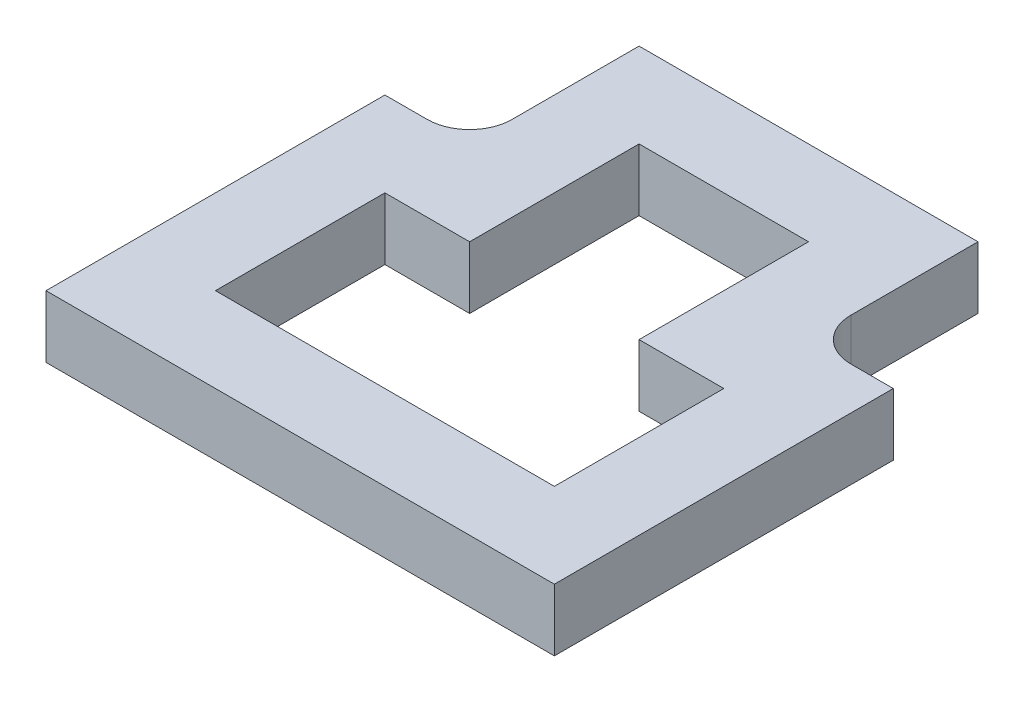
ISO-10303-21;
HEADER;
FILE_DESCRIPTION(('STEP AP214'),'2;1');
FILE_NAME('part.step','',(''),(''),'','','');
FILE_SCHEMA(('AUTOMOTIVE_DESIGN { 1 0 10303 214 1 1 1 1 }'));
ENDSEC;
DATA;
#1=APPLICATION_CONTEXT('core data for automotive mechanical design processes');
#2=APPLICATION_PROTOCOL_DEFINITION('international standard','automotive_design',2000,#1);
#3=PRODUCT_CONTEXT('',#1,'mechanical');
#4=PRODUCT('Part','Part','',(#3));
#5=PRODUCT_RELATED_PRODUCT_CATEGORY('part','',(#4));
#6=PRODUCT_DEFINITION_FORMATION('','',#4);
#7=PRODUCT_DEFINITION_CONTEXT('part definition',#1,'design');
#8=PRODUCT_DEFINITION('design','',#6,#7);
#9=PRODUCT_DEFINITION_SHAPE('','',#8);
#10=(LENGTH_UNIT() NAMED_UNIT(*) SI_UNIT(.MILLI.,.METRE.));
#11=(NAMED_UNIT(*) PLANE_ANGLE_UNIT() SI_UNIT($,.RADIAN.));
#12=(NAMED_UNIT(*) SI_UNIT($,.STERADIAN.) SOLID_ANGLE_UNIT());
#13=UNCERTAINTY_MEASURE_WITH_UNIT(LENGTH_MEASURE(1.E-05),#10,'distance_accuracy_value','');
#14=(GEOMETRIC_REPRESENTATION_CONTEXT(3) GLOBAL_UNCERTAINTY_ASSIGNED_CONTEXT((#13)) GLOBAL_UNIT_ASSIGNED_CONTEXT((#10,
#11,#12)) REPRESENTATION_CONTEXT('',''));
#15=CARTESIAN_POINT('',(0.,0.,0.));
#16=DIRECTION('',(0.,0.,1.));
#17=DIRECTION('',(1.,0.,0.));
#18=AXIS2_PLACEMENT_3D('',#15,#16,#17);
#19=CARTESIAN_POINT('',(37.5,14.,-7.49999999999994));
#20=DIRECTION('',(0.,-1.,0.));
#21=DIRECTION('',(0.,0.,-1.));
#22=AXIS2_PLACEMENT_3D('',#19,#20,#21);
#23=CYLINDRICAL_SURFACE('',#22,7.49999999999994);
#24=DIRECTION('',(0.,-1.,0.));
#25=VECTOR('',#24,1.);
#26=CARTESIAN_POINT('',(37.5,14.,0.));
#27=LINE('',#26,#25);
#28=CARTESIAN_POINT('',(37.5,19.,0.));
#29=VERTEX_POINT('',#28);
#30=CARTESIAN_POINT('',(37.5,8.,0.));
#31=VERTEX_POINT('',#30);
#32=EDGE_CURVE('E283',#29,#31,#27,.T.);
#33=ORIENTED_EDGE('',*,*,#32,.T.);
#34=CARTESIAN_POINT('',(37.5,8.,-7.49999999999994));
#35=DIRECTION('',(0.,1.,0.));
#36=DIRECTION('',(0.,0.,1.));
#37=AXIS2_PLACEMENT_3D('',#34,#35,#36);
#38=CIRCLE('',#37,7.49999999999994);
#39=CARTESIAN_POINT('',(30.,8.,-7.5));
#40=VERTEX_POINT('',#39);
#41=EDGE_CURVE('E258',#31,#40,#38,.F.);
#42=ORIENTED_EDGE('',*,*,#41,.T.);
#43=DIRECTION('',(0.,-1.,0.));
#44=VECTOR('',#43,1.);
#45=CARTESIAN_POINT('',(30.,14.,-7.5));
#46=LINE('',#45,#44);
#47=CARTESIAN_POINT('',(30.,19.,-7.5));
#48=VERTEX_POINT('',#47);
#49=EDGE_CURVE('E287',#48,#40,#46,.T.);
#50=ORIENTED_EDGE('',*,*,#49,.F.);
#51=CARTESIAN_POINT('',(37.5,19.,-7.49999999999994));
#52=DIRECTION('',(0.,-1.,0.));
#53=DIRECTION('',(0.,0.,1.));
#54=AXIS2_PLACEMENT_3D('',#51,#52,#53);
#55=CIRCLE('',#54,7.49999999999997);
#56=EDGE_CURVE('E225',#29,#48,#55,.T.);
#57=ORIENTED_EDGE('',*,*,#56,.F.);
#58=EDGE_LOOP('',(#33,#42,#50,#57));
#59=FACE_BOUND('',#58,.T.);
#60=ADVANCED_FACE('F42',(#59),#23,.F.);
#61=CARTESIAN_POINT('',(-37.5,14.,-7.5));
#62=DIRECTION('',(0.,-1.,0.));
#63=DIRECTION('',(0.,0.,-1.));
#64=AXIS2_PLACEMENT_3D('',#61,#62,#63);
#65=CYLINDRICAL_SURFACE('',#64,7.5);
#66=DIRECTION('',(0.,-1.,0.));
#67=VECTOR('',#66,1.);
#68=CARTESIAN_POINT('',(-30.,14.,-7.5));
#69=LINE('',#68,#67);
#70=CARTESIAN_POINT('',(-30.,19.,-7.49999999999999));
#71=VERTEX_POINT('',#70);
#72=CARTESIAN_POINT('',(-30.,8.,-7.5));
#73=VERTEX_POINT('',#72);
#74=EDGE_CURVE('E290',#71,#73,#69,.T.);
#75=ORIENTED_EDGE('',*,*,#74,.T.);
#76=CARTESIAN_POINT('',(-37.5,8.,-7.5));
#77=DIRECTION('',(0.,1.,0.));
#78=DIRECTION('',(0.,0.,1.));
#79=AXIS2_PLACEMENT_3D('',#76,#77,#78);
#80=CIRCLE('',#79,7.5);
#81=CARTESIAN_POINT('',(-37.5,8.,0.));
#82=VERTEX_POINT('',#81);
#83=EDGE_CURVE('E255',#73,#82,#80,.F.);
#84=ORIENTED_EDGE('',*,*,#83,.T.);
#85=DIRECTION('',(0.,-1.,0.));
#86=VECTOR('',#85,1.);
#87=CARTESIAN_POINT('',(-37.5,14.,0.));
#88=LINE('',#87,#86);
#89=CARTESIAN_POINT('',(-37.5,19.,0.));
#90=VERTEX_POINT('',#89);
#91=EDGE_CURVE('E282',#90,#82,#88,.T.);
#92=ORIENTED_EDGE('',*,*,#91,.F.);
#93=CARTESIAN_POINT('',(-37.5,19.,-7.5));
#94=DIRECTION('',(0.,-1.,0.));
#95=DIRECTION('',(0.,0.,1.));
#96=AXIS2_PLACEMENT_3D('',#93,#94,#95);
#97=CIRCLE('',#96,7.5);
#98=EDGE_CURVE('E207',#71,#90,#97,.T.);
#99=ORIENTED_EDGE('',*,*,#98,.F.);
#100=EDGE_LOOP('',(#75,#84,#92,#99));
#101=FACE_BOUND('',#100,.T.);
#102=ADVANCED_FACE('F331',(#101),#65,.F.);
#103=CARTESIAN_POINT('',(-30.,6.,-30.));
#104=DIRECTION('',(1.,0.,0.));
#105=DIRECTION('',(0.,0.,-1.));
#106=AXIS2_PLACEMENT_3D('',#103,#104,#105);
#107=PLANE('',#106);
#108=ORIENTED_EDGE('',*,*,#74,.F.);
#109=DIRECTION('',(0.,0.,1.));
#110=VECTOR('',#109,1.);
#111=CARTESIAN_POINT('',(-30.,19.,-7.49999999999999));
#112=LINE('',#111,#110);
#113=CARTESIAN_POINT('',(-30.,19.,-30.));
#114=VERTEX_POINT('',#113);
#115=EDGE_CURVE('E234',#114,#71,#112,.T.);
#116=ORIENTED_EDGE('',*,*,#115,.F.);
#117=DIRECTION('',(0.,1.,0.));
#118=VECTOR('',#117,1.);
#119=CARTESIAN_POINT('',(-30.,3.,-30.));
#120=LINE('',#119,#118);
#121=CARTESIAN_POINT('',(-30.,8.,-30.));
#122=VERTEX_POINT('',#121);
#123=EDGE_CURVE('E239',#122,#114,#120,.T.);
#124=ORIENTED_EDGE('',*,*,#123,.F.);
#125=DIRECTION('',(0.,0.,1.));
#126=VECTOR('',#125,1.);
#127=CARTESIAN_POINT('',(-30.,8.,-30.));
#128=LINE('',#127,#126);
#129=EDGE_CURVE('E253',#122,#73,#128,.T.);
#130=ORIENTED_EDGE('',*,*,#129,.T.);
#131=EDGE_LOOP('',(#108,#116,#124,#130));
#132=FACE_BOUND('',#131,.T.);
#133=ADVANCED_FACE('F44',(#132),#107,.F.);
#134=CARTESIAN_POINT('',(45.,6.,0.));
#135=DIRECTION('',(0.,0.,1.));
#136=DIRECTION('',(1.,0.,0.));
#137=AXIS2_PLACEMENT_3D('',#134,#135,#136);
#138=PLANE('',#137);
#139=DIRECTION('',(0.,-1.,0.));
#140=VECTOR('',#139,1.);
#141=CARTESIAN_POINT('',(45.,6.,0.));
#142=LINE('',#141,#140);
#143=CARTESIAN_POINT('',(45.,19.,0.));
#144=VERTEX_POINT('',#143);
#145=CARTESIAN_POINT('',(45.,8.,0.));
#146=VERTEX_POINT('',#145);
#147=EDGE_CURVE('E298',#144,#146,#142,.T.);
#148=ORIENTED_EDGE('',*,*,#147,.T.);
#149=DIRECTION('',(-1.,0.,0.));
#150=VECTOR('',#149,1.);
#151=CARTESIAN_POINT('',(45.,8.,0.));
#152=LINE('',#151,#150);
#153=EDGE_CURVE('E264',#146,#31,#152,.T.);
#154=ORIENTED_EDGE('',*,*,#153,.T.);
#155=ORIENTED_EDGE('',*,*,#32,.F.);
#156=DIRECTION('',(-1.,0.,0.));
#157=VECTOR('',#156,1.);
#158=CARTESIAN_POINT('',(45.,19.,0.));
#159=LINE('',#158,#157);
#160=EDGE_CURVE('E222',#144,#29,#159,.T.);
#161=ORIENTED_EDGE('',*,*,#160,.F.);
#162=EDGE_LOOP('',(#148,#154,#155,#161));
#163=FACE_BOUND('',#162,.T.);
#164=ADVANCED_FACE('F346',(#163),#138,.F.);
#165=CARTESIAN_POINT('',(-30.,6.,0.));
#166=DIRECTION('',(0.,0.,1.));
#167=DIRECTION('',(1.,0.,0.));
#168=AXIS2_PLACEMENT_3D('',#165,#166,#167);
#169=PLANE('',#168);
#170=ORIENTED_EDGE('',*,*,#91,.T.);
#171=DIRECTION('',(-1.,0.,0.));
#172=VECTOR('',#171,1.);
#173=CARTESIAN_POINT('',(-30.,8.,0.));
#174=LINE('',#173,#172);
#175=CARTESIAN_POINT('',(-45.,8.,0.));
#176=VERTEX_POINT('',#175);
#177=EDGE_CURVE('E261',#82,#176,#174,.T.);
#178=ORIENTED_EDGE('',*,*,#177,.T.);
#179=DIRECTION('',(0.,-1.,0.));
#180=VECTOR('',#179,1.);
#181=CARTESIAN_POINT('',(-45.,6.,0.));
#182=LINE('',#181,#180);
#183=CARTESIAN_POINT('',(-45.,19.,0.));
#184=VERTEX_POINT('',#183);
#185=EDGE_CURVE('E50',#184,#176,#182,.T.);
#186=ORIENTED_EDGE('',*,*,#185,.F.);
#187=DIRECTION('',(-1.,0.,0.));
#188=VECTOR('',#187,1.);
#189=CARTESIAN_POINT('',(-37.5,19.,0.));
#190=LINE('',#189,#188);
#191=EDGE_CURVE('E210',#90,#184,#190,.T.);
#192=ORIENTED_EDGE('',*,*,#191,.F.);
#193=EDGE_LOOP('',(#170,#178,#186,#192));
#194=FACE_BOUND('',#193,.T.);
#195=ADVANCED_FACE('F325',(#194),#169,.F.);
#196=CARTESIAN_POINT('',(-45.,6.,0.));
#197=DIRECTION('',(1.,0.,0.));
#198=DIRECTION('',(0.,0.,-1.));
#199=AXIS2_PLACEMENT_3D('',#196,#197,#198);
#200=PLANE('',#199);
#201=ORIENTED_EDGE('',*,*,#185,.T.);
#202=DIRECTION('',(0.,0.,1.));
#203=VECTOR('',#202,1.);
#204=CARTESIAN_POINT('',(-45.,8.,-33.));
#205=LINE('',#204,#203);
#206=CARTESIAN_POINT('',(-45.,8.,60.));
#207=VERTEX_POINT('',#206);
#208=EDGE_CURVE('E246',#176,#207,#205,.T.);
#209=ORIENTED_EDGE('',*,*,#208,.T.);
#210=DIRECTION('',(0.,-1.,0.));
#211=VECTOR('',#210,1.);
#212=CARTESIAN_POINT('',(-45.,6.,60.));
#213=LINE('',#212,#211);
#214=CARTESIAN_POINT('',(-45.,19.,60.));
#215=VERTEX_POINT('',#214);
#216=EDGE_CURVE('E317',#215,#207,#213,.T.);
#217=ORIENTED_EDGE('',*,*,#216,.F.);
#218=DIRECTION('',(0.,0.,1.));
#219=VECTOR('',#218,1.);
#220=CARTESIAN_POINT('',(-45.,19.,0.));
#221=LINE('',#220,#219);
#222=EDGE_CURVE('E213',#184,#215,#221,.T.);
#223=ORIENTED_EDGE('',*,*,#222,.F.);
#224=EDGE_LOOP('',(#201,#209,#217,#223));
#225=FACE_BOUND('',#224,.T.);
#226=ADVANCED_FACE('F322',(#225),#200,.F.);
#227=CARTESIAN_POINT('',(-45.,6.,60.));
#228=DIRECTION('',(0.,0.,-1.));
#229=DIRECTION('',(-1.,0.,0.));
#230=AXIS2_PLACEMENT_3D('',#227,#228,#229);
#231=PLANE('',#230);
#232=ORIENTED_EDGE('',*,*,#216,.T.);
#233=DIRECTION('',(-1.,0.,0.));
#234=VECTOR('',#233,1.);
#235=CARTESIAN_POINT('',(-45.,8.,60.));
#236=LINE('',#235,#234);
#237=CARTESIAN_POINT('',(45.,8.,60.));
#238=VERTEX_POINT('',#237);
#239=EDGE_CURVE('E242',#238,#207,#236,.T.);
#240=ORIENTED_EDGE('',*,*,#239,.F.);
#241=DIRECTION('',(0.,-1.,0.));
#242=VECTOR('',#241,1.);
#243=CARTESIAN_POINT('',(45.,6.,60.));
#244=LINE('',#243,#242);
#245=CARTESIAN_POINT('',(45.,19.,60.));
#246=VERTEX_POINT('',#245);
#247=EDGE_CURVE('E314',#246,#238,#244,.T.);
#248=ORIENTED_EDGE('',*,*,#247,.F.);
#249=DIRECTION('',(1.,0.,0.));
#250=VECTOR('',#249,1.);
#251=CARTESIAN_POINT('',(-45.,19.,60.));
#252=LINE('',#251,#250);
#253=EDGE_CURVE('E216',#215,#246,#252,.T.);
#254=ORIENTED_EDGE('',*,*,#253,.F.);
#255=EDGE_LOOP('',(#232,#240,#248,#254));
#256=FACE_BOUND('',#255,.T.);
#257=ADVANCED_FACE('F339',(#256),#231,.F.);
#258=CARTESIAN_POINT('',(45.,6.,60.));
#259=DIRECTION('',(-1.,0.,0.));
#260=DIRECTION('',(0.,0.,1.));
#261=AXIS2_PLACEMENT_3D('',#258,#259,#260);
#262=PLANE('',#261);
#263=ORIENTED_EDGE('',*,*,#247,.T.);
#264=DIRECTION('',(0.,0.,1.));
#265=VECTOR('',#264,1.);
#266=CARTESIAN_POINT('',(45.,8.,-33.));
#267=LINE('',#266,#265);
#268=EDGE_CURVE('E245',#146,#238,#267,.T.);
#269=ORIENTED_EDGE('',*,*,#268,.F.);
#270=ORIENTED_EDGE('',*,*,#147,.F.);
#271=DIRECTION('',(0.,0.,-1.));
#272=VECTOR('',#271,1.);
#273=CARTESIAN_POINT('',(45.,19.,60.));
#274=LINE('',#273,#272);
#275=EDGE_CURVE('E219',#246,#144,#274,.T.);
#276=ORIENTED_EDGE('',*,*,#275,.F.);
#277=EDGE_LOOP('',(#263,#269,#270,#276));
#278=FACE_BOUND('',#277,.T.);
#279=ADVANCED_FACE('F342',(#278),#262,.F.);
#280=CARTESIAN_POINT('',(30.,6.,0.));
#281=DIRECTION('',(-1.,0.,0.));
#282=DIRECTION('',(0.,0.,1.));
#283=AXIS2_PLACEMENT_3D('',#280,#281,#282);
#284=PLANE('',#283);
#285=DIRECTION('',(0.,0.,-1.));
#286=VECTOR('',#285,1.);
#287=CARTESIAN_POINT('',(30.,8.,0.));
#288=LINE('',#287,#286);
#289=CARTESIAN_POINT('',(30.,8.,-30.));
#290=VERTEX_POINT('',#289);
#291=EDGE_CURVE('E249',#40,#290,#288,.T.);
#292=ORIENTED_EDGE('',*,*,#291,.T.);
#293=DIRECTION('',(0.,1.,0.));
#294=VECTOR('',#293,1.);
#295=CARTESIAN_POINT('',(30.,3.,-30.));
#296=LINE('',#295,#294);
#297=CARTESIAN_POINT('',(30.,19.,-30.));
#298=VERTEX_POINT('',#297);
#299=EDGE_CURVE('E57',#290,#298,#296,.T.);
#300=ORIENTED_EDGE('',*,*,#299,.T.);
#301=DIRECTION('',(0.,0.,-1.));
#302=VECTOR('',#301,1.);
#303=CARTESIAN_POINT('',(30.,19.,-30.));
#304=LINE('',#303,#302);
#305=EDGE_CURVE('E228',#48,#298,#304,.T.);
#306=ORIENTED_EDGE('',*,*,#305,.F.);
#307=ORIENTED_EDGE('',*,*,#49,.T.);
#308=EDGE_LOOP('',(#292,#300,#306,#307));
#309=FACE_BOUND('',#308,.T.);
#310=ADVANCED_FACE('F350',(#309),#284,.F.);
#311=CARTESIAN_POINT('',(30.,6.,45.));
#312=DIRECTION('',(0.,0.,1.));
#313=DIRECTION('',(1.,0.,0.));
#314=AXIS2_PLACEMENT_3D('',#311,#312,#313);
#315=PLANE('',#314);
#316=DIRECTION('',(0.,-1.,0.));
#317=VECTOR('',#316,1.);
#318=CARTESIAN_POINT('',(30.,6.,45.));
#319=LINE('',#318,#317);
#320=CARTESIAN_POINT('',(30.,19.,45.));
#321=VERTEX_POINT('',#320);
#322=CARTESIAN_POINT('',(30.,8.,45.));
#323=VERTEX_POINT('',#322);
#324=EDGE_CURVE('E295',#321,#323,#319,.T.);
#325=ORIENTED_EDGE('',*,*,#324,.T.);
#326=DIRECTION('',(-1.,0.,0.));
#327=VECTOR('',#326,1.);
#328=CARTESIAN_POINT('',(30.,8.,45.));
#329=LINE('',#328,#327);
#330=CARTESIAN_POINT('',(-30.,8.,45.));
#331=VERTEX_POINT('',#330);
#332=EDGE_CURVE('E276',#323,#331,#329,.T.);
#333=ORIENTED_EDGE('',*,*,#332,.T.);
#334=DIRECTION('',(0.,-1.,0.));
#335=VECTOR('',#334,1.);
#336=CARTESIAN_POINT('',(-30.,6.,45.));
#337=LINE('',#336,#335);
#338=CARTESIAN_POINT('',(-30.,19.,45.));
#339=VERTEX_POINT('',#338);
#340=EDGE_CURVE('E286',#339,#331,#337,.T.);
#341=ORIENTED_EDGE('',*,*,#340,.F.);
#342=DIRECTION('',(1.,0.,0.));
#343=VECTOR('',#342,1.);
#344=CARTESIAN_POINT('',(-30.,19.,45.));
#345=LINE('',#344,#343);
#346=EDGE_CURVE('E196',#339,#321,#345,.T.);
#347=ORIENTED_EDGE('',*,*,#346,.T.);
#348=EDGE_LOOP('',(#325,#333,#341,#347));
#349=FACE_BOUND('',#348,.T.);
#350=ADVANCED_FACE('F372',(#349),#315,.F.);
#351=CARTESIAN_POINT('',(30.,6.,15.));
#352=DIRECTION('',(1.,0.,0.));
#353=DIRECTION('',(0.,0.,-1.));
#354=AXIS2_PLACEMENT_3D('',#351,#352,#353);
#355=PLANE('',#354);
#356=DIRECTION('',(0.,-1.,0.));
#357=VECTOR('',#356,1.);
#358=CARTESIAN_POINT('',(30.,6.,15.));
#359=LINE('',#358,#357);
#360=CARTESIAN_POINT('',(30.,19.,15.));
#361=VERTEX_POINT('',#360);
#362=CARTESIAN_POINT('',(30.,8.,15.));
#363=VERTEX_POINT('',#362);
#364=EDGE_CURVE('E299',#361,#363,#359,.T.);
#365=ORIENTED_EDGE('',*,*,#364,.T.);
#366=DIRECTION('',(0.,0.,1.));
#367=VECTOR('',#366,1.);
#368=CARTESIAN_POINT('',(30.,8.,15.));
#369=LINE('',#368,#367);
#370=EDGE_CURVE('E273',#363,#323,#369,.T.);
#371=ORIENTED_EDGE('',*,*,#370,.T.);
#372=ORIENTED_EDGE('',*,*,#324,.F.);
#373=DIRECTION('',(0.,0.,-1.));
#374=VECTOR('',#373,1.);
#375=CARTESIAN_POINT('',(30.,19.,45.));
#376=LINE('',#375,#374);
#377=EDGE_CURVE('E199',#321,#361,#376,.T.);
#378=ORIENTED_EDGE('',*,*,#377,.T.);
#379=EDGE_LOOP('',(#365,#371,#372,#378));
#380=FACE_BOUND('',#379,.T.);
#381=ADVANCED_FACE('F368',(#380),#355,.F.);
#382=CARTESIAN_POINT('',(15.,6.,15.));
#383=DIRECTION('',(0.,0.,-1.));
#384=DIRECTION('',(-1.,0.,0.));
#385=AXIS2_PLACEMENT_3D('',#382,#383,#384);
#386=PLANE('',#385);
#387=DIRECTION('',(0.,-1.,0.));
#388=VECTOR('',#387,1.);
#389=CARTESIAN_POINT('',(15.,6.,15.));
#390=LINE('',#389,#388);
#391=CARTESIAN_POINT('',(15.,19.,15.));
#392=VERTEX_POINT('',#391);
#393=CARTESIAN_POINT('',(15.,8.,15.));
#394=VERTEX_POINT('',#393);
#395=EDGE_CURVE('E302',#392,#394,#390,.T.);
#396=ORIENTED_EDGE('',*,*,#395,.T.);
#397=DIRECTION('',(1.,0.,0.));
#398=VECTOR('',#397,1.);
#399=CARTESIAN_POINT('',(15.,8.,15.));
#400=LINE('',#399,#398);
#401=EDGE_CURVE('E270',#394,#363,#400,.T.);
#402=ORIENTED_EDGE('',*,*,#401,.T.);
#403=ORIENTED_EDGE('',*,*,#364,.F.);
#404=DIRECTION('',(-1.,0.,0.));
#405=VECTOR('',#404,1.);
#406=CARTESIAN_POINT('',(30.,19.,15.));
#407=LINE('',#406,#405);
#408=EDGE_CURVE('E202',#361,#392,#407,.T.);
#409=ORIENTED_EDGE('',*,*,#408,.T.);
#410=EDGE_LOOP('',(#396,#402,#403,#409));
#411=FACE_BOUND('',#410,.T.);
#412=ADVANCED_FACE('F371',(#411),#386,.F.);
#413=CARTESIAN_POINT('',(15.,6.,-15.));
#414=DIRECTION('',(1.,0.,0.));
#415=DIRECTION('',(0.,0.,-1.));
#416=AXIS2_PLACEMENT_3D('',#413,#414,#415);
#417=PLANE('',#416);
#418=ORIENTED_EDGE('',*,*,#395,.F.);
#419=DIRECTION('',(0.,0.,-1.));
#420=VECTOR('',#419,1.);
#421=CARTESIAN_POINT('',(15.,19.,15.));
#422=LINE('',#421,#420);
#423=CARTESIAN_POINT('',(15.,19.,-15.));
#424=VERTEX_POINT('',#423);
#425=EDGE_CURVE('E205',#392,#424,#422,.T.);
#426=ORIENTED_EDGE('',*,*,#425,.T.);
#427=DIRECTION('',(0.,1.,0.));
#428=VECTOR('',#427,1.);
#429=CARTESIAN_POINT('',(15.,3.,-15.));
#430=LINE('',#429,#428);
#431=CARTESIAN_POINT('',(15.,8.,-15.));
#432=VERTEX_POINT('',#431);
#433=EDGE_CURVE('E176',#432,#424,#430,.T.);
#434=ORIENTED_EDGE('',*,*,#433,.F.);
#435=DIRECTION('',(0.,0.,1.));
#436=VECTOR('',#435,1.);
#437=CARTESIAN_POINT('',(15.,8.,-15.));
#438=LINE('',#437,#436);
#439=EDGE_CURVE('E268',#432,#394,#438,.T.);
#440=ORIENTED_EDGE('',*,*,#439,.T.);
#441=EDGE_LOOP('',(#418,#426,#434,#440));
#442=FACE_BOUND('',#441,.T.);
#443=ADVANCED_FACE('F376',(#442),#417,.F.);
#444=CARTESIAN_POINT('',(-15.,6.,15.));
#445=DIRECTION('',(-1.,0.,0.));
#446=DIRECTION('',(0.,0.,1.));
#447=AXIS2_PLACEMENT_3D('',#444,#445,#446);
#448=PLANE('',#447);
#449=DIRECTION('',(0.,0.,-1.));
#450=VECTOR('',#449,1.);
#451=CARTESIAN_POINT('',(-15.,8.,15.));
#452=LINE('',#451,#450);
#453=CARTESIAN_POINT('',(-15.,8.,15.));
#454=VERTEX_POINT('',#453);
#455=CARTESIAN_POINT('',(-15.,8.,-15.));
#456=VERTEX_POINT('',#455);
#457=EDGE_CURVE('E174',#454,#456,#452,.T.);
#458=ORIENTED_EDGE('',*,*,#457,.T.);
#459=DIRECTION('',(0.,1.,0.));
#460=VECTOR('',#459,1.);
#461=CARTESIAN_POINT('',(-15.,3.,-15.));
#462=LINE('',#461,#460);
#463=CARTESIAN_POINT('',(-15.,19.,-15.));
#464=VERTEX_POINT('',#463);
#465=EDGE_CURVE('E167',#456,#464,#462,.T.);
#466=ORIENTED_EDGE('',*,*,#465,.T.);
#467=DIRECTION('',(0.,0.,1.));
#468=VECTOR('',#467,1.);
#469=CARTESIAN_POINT('',(-15.,19.,-15.));
#470=LINE('',#469,#468);
#471=CARTESIAN_POINT('',(-15.,19.,15.));
#472=VERTEX_POINT('',#471);
#473=EDGE_CURVE('E172',#464,#472,#470,.T.);
#474=ORIENTED_EDGE('',*,*,#473,.T.);
#475=DIRECTION('',(0.,-1.,0.));
#476=VECTOR('',#475,1.);
#477=CARTESIAN_POINT('',(-15.,6.,15.));
#478=LINE('',#477,#476);
#479=EDGE_CURVE('E305',#472,#454,#478,.T.);
#480=ORIENTED_EDGE('',*,*,#479,.T.);
#481=EDGE_LOOP('',(#458,#466,#474,#480));
#482=FACE_BOUND('',#481,.T.);
#483=ADVANCED_FACE('F169',(#482),#448,.F.);
#484=CARTESIAN_POINT('',(-30.,6.,15.));
#485=DIRECTION('',(0.,0.,-1.));
#486=DIRECTION('',(-1.,0.,0.));
#487=AXIS2_PLACEMENT_3D('',#484,#485,#486);
#488=PLANE('',#487);
#489=DIRECTION('',(0.,-1.,0.));
#490=VECTOR('',#489,1.);
#491=CARTESIAN_POINT('',(-30.,6.,15.));
#492=LINE('',#491,#490);
#493=CARTESIAN_POINT('',(-30.,19.,15.));
#494=VERTEX_POINT('',#493);
#495=CARTESIAN_POINT('',(-30.,8.,15.));
#496=VERTEX_POINT('',#495);
#497=EDGE_CURVE('E307',#494,#496,#492,.T.);
#498=ORIENTED_EDGE('',*,*,#497,.T.);
#499=DIRECTION('',(1.,0.,0.));
#500=VECTOR('',#499,1.);
#501=CARTESIAN_POINT('',(-30.,8.,15.));
#502=LINE('',#501,#500);
#503=EDGE_CURVE('E64',#496,#454,#502,.T.);
#504=ORIENTED_EDGE('',*,*,#503,.T.);
#505=ORIENTED_EDGE('',*,*,#479,.F.);
#506=DIRECTION('',(-1.,0.,0.));
#507=VECTOR('',#506,1.);
#508=CARTESIAN_POINT('',(-15.,19.,15.));
#509=LINE('',#508,#507);
#510=EDGE_CURVE('E189',#472,#494,#509,.T.);
#511=ORIENTED_EDGE('',*,*,#510,.T.);
#512=EDGE_LOOP('',(#498,#504,#505,#511));
#513=FACE_BOUND('',#512,.T.);
#514=ADVANCED_FACE('F383',(#513),#488,.F.);
#515=CARTESIAN_POINT('',(-30.,6.,45.));
#516=DIRECTION('',(-1.,0.,0.));
#517=DIRECTION('',(0.,0.,1.));
#518=AXIS2_PLACEMENT_3D('',#515,#516,#517);
#519=PLANE('',#518);
#520=ORIENTED_EDGE('',*,*,#340,.T.);
#521=DIRECTION('',(0.,0.,-1.));
#522=VECTOR('',#521,1.);
#523=CARTESIAN_POINT('',(-30.,8.,45.));
#524=LINE('',#523,#522);
#525=EDGE_CURVE('E279',#331,#496,#524,.T.);
#526=ORIENTED_EDGE('',*,*,#525,.T.);
#527=ORIENTED_EDGE('',*,*,#497,.F.);
#528=DIRECTION('',(0.,0.,1.));
#529=VECTOR('',#528,1.);
#530=CARTESIAN_POINT('',(-30.,19.,15.));
#531=LINE('',#530,#529);
#532=EDGE_CURVE('E191',#494,#339,#531,.T.);
#533=ORIENTED_EDGE('',*,*,#532,.T.);
#534=EDGE_LOOP('',(#520,#526,#527,#533));
#535=FACE_BOUND('',#534,.T.);
#536=ADVANCED_FACE('F386',(#535),#519,.F.);
#537=CARTESIAN_POINT('',(-45.,8.,-33.));
#538=DIRECTION('',(0.,1.,0.));
#539=DIRECTION('',(0.,0.,1.));
#540=AXIS2_PLACEMENT_3D('',#537,#538,#539);
#541=PLANE('',#540);
#542=ORIENTED_EDGE('',*,*,#129,.F.);
#543=DIRECTION('',(1.,0.,0.));
#544=VECTOR('',#543,1.);
#545=CARTESIAN_POINT('',(-45.,8.,-30.));
#546=LINE('',#545,#544);
#547=EDGE_CURVE('E11',#122,#290,#546,.T.);
#548=ORIENTED_EDGE('',*,*,#547,.T.);
#549=ORIENTED_EDGE('',*,*,#291,.F.);
#550=ORIENTED_EDGE('',*,*,#41,.F.);
#551=ORIENTED_EDGE('',*,*,#153,.F.);
#552=ORIENTED_EDGE('',*,*,#268,.T.);
#553=ORIENTED_EDGE('',*,*,#239,.T.);
#554=ORIENTED_EDGE('',*,*,#208,.F.);
#555=ORIENTED_EDGE('',*,*,#177,.F.);
#556=ORIENTED_EDGE('',*,*,#83,.F.);
#557=EDGE_LOOP('',(#542,#548,#549,#550,#551,#552,#553,#554,#555,#556));
#558=FACE_BOUND('',#557,.T.);
#559=DIRECTION('',(-1.,0.,0.));
#560=VECTOR('',#559,1.);
#561=CARTESIAN_POINT('',(-15.,8.,-15.));
#562=LINE('',#561,#560);
#563=EDGE_CURVE('E237',#432,#456,#562,.T.);
#564=ORIENTED_EDGE('',*,*,#563,.T.);
#565=ORIENTED_EDGE('',*,*,#457,.F.);
#566=ORIENTED_EDGE('',*,*,#503,.F.);
#567=ORIENTED_EDGE('',*,*,#525,.F.);
#568=ORIENTED_EDGE('',*,*,#332,.F.);
#569=ORIENTED_EDGE('',*,*,#370,.F.);
#570=ORIENTED_EDGE('',*,*,#401,.F.);
#571=ORIENTED_EDGE('',*,*,#439,.F.);
#572=EDGE_LOOP('',(#564,#565,#566,#567,#568,#569,#570,#571));
#573=FACE_BOUND('',#572,.T.);
#574=ADVANCED_FACE('F335',(#558,#573),#541,.F.);
#575=CARTESIAN_POINT('',(-15.,3.,-15.));
#576=DIRECTION('',(0.,0.,1.));
#577=DIRECTION('',(1.,0.,0.));
#578=AXIS2_PLACEMENT_3D('',#575,#576,#577);
#579=PLANE('',#578);
#580=ORIENTED_EDGE('',*,*,#563,.F.);
#581=ORIENTED_EDGE('',*,*,#433,.T.);
#582=DIRECTION('',(-1.,0.,0.));
#583=VECTOR('',#582,1.);
#584=CARTESIAN_POINT('',(15.,19.,-15.));
#585=LINE('',#584,#583);
#586=EDGE_CURVE('E179',#424,#464,#585,.T.);
#587=ORIENTED_EDGE('',*,*,#586,.T.);
#588=ORIENTED_EDGE('',*,*,#465,.F.);
#589=EDGE_LOOP('',(#580,#581,#587,#588));
#590=FACE_BOUND('',#589,.T.);
#591=ADVANCED_FACE('F180',(#590),#579,.T.);
#592=CARTESIAN_POINT('',(-30.,3.,-30.));
#593=DIRECTION('',(0.,0.,1.));
#594=DIRECTION('',(1.,0.,0.));
#595=AXIS2_PLACEMENT_3D('',#592,#593,#594);
#596=PLANE('',#595);
#597=ORIENTED_EDGE('',*,*,#123,.T.);
#598=DIRECTION('',(-1.,0.,0.));
#599=VECTOR('',#598,1.);
#600=CARTESIAN_POINT('',(-30.,19.,-30.));
#601=LINE('',#600,#599);
#602=EDGE_CURVE('E231',#298,#114,#601,.T.);
#603=ORIENTED_EDGE('',*,*,#602,.F.);
#604=ORIENTED_EDGE('',*,*,#299,.F.);
#605=ORIENTED_EDGE('',*,*,#547,.F.);
#606=EDGE_LOOP('',(#597,#603,#604,#605));
#607=FACE_BOUND('',#606,.T.);
#608=ADVANCED_FACE('F352',(#607),#596,.F.);
#609=CARTESIAN_POINT('',(-37.5,19.,-7.5));
#610=DIRECTION('',(0.,1.,0.));
#611=DIRECTION('',(0.,0.,1.));
#612=AXIS2_PLACEMENT_3D('',#609,#610,#611);
#613=PLANE('',#612);
#614=ORIENTED_EDGE('',*,*,#98,.T.);
#615=ORIENTED_EDGE('',*,*,#191,.T.);
#616=ORIENTED_EDGE('',*,*,#222,.T.);
#617=ORIENTED_EDGE('',*,*,#253,.T.);
#618=ORIENTED_EDGE('',*,*,#275,.T.);
#619=ORIENTED_EDGE('',*,*,#160,.T.);
#620=ORIENTED_EDGE('',*,*,#56,.T.);
#621=ORIENTED_EDGE('',*,*,#305,.T.);
#622=ORIENTED_EDGE('',*,*,#602,.T.);
#623=ORIENTED_EDGE('',*,*,#115,.T.);
#624=EDGE_LOOP('',(#614,#615,#616,#617,#618,#619,#620,#621,#622,#623));
#625=FACE_BOUND('',#624,.T.);
#626=ORIENTED_EDGE('',*,*,#473,.F.);
#627=ORIENTED_EDGE('',*,*,#586,.F.);
#628=ORIENTED_EDGE('',*,*,#425,.F.);
#629=ORIENTED_EDGE('',*,*,#408,.F.);
#630=ORIENTED_EDGE('',*,*,#377,.F.);
#631=ORIENTED_EDGE('',*,*,#346,.F.);
#632=ORIENTED_EDGE('',*,*,#532,.F.);
#633=ORIENTED_EDGE('',*,*,#510,.F.);
#634=EDGE_LOOP('',(#626,#627,#628,#629,#630,#631,#632,#633));
#635=FACE_BOUND('',#634,.T.);
#636=ADVANCED_FACE('F186',(#625,#635),#613,.T.);
#637=CLOSED_SHELL('',(#60,#102,#133,#164,#195,#226,#257,#279,#310,#350,#381,#412,#443,#483,#514,
#536,#574,#591,#608,#636));
#638=MANIFOLD_SOLID_BREP('B2',#637);
#639=ADVANCED_BREP_SHAPE_REPRESENTATION('',(#18,#638),#14);
#640=SHAPE_DEFINITION_REPRESENTATION(#9,#639);
ENDSEC;
END-ISO-10303-21;
